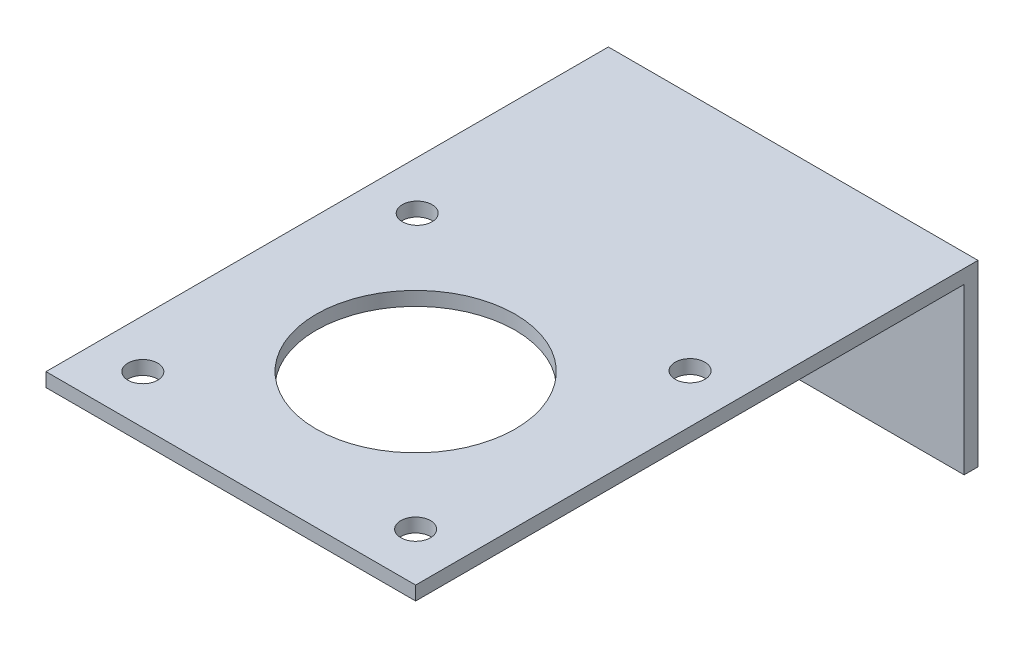
ISO-10303-21;
HEADER;
FILE_DESCRIPTION(('STEP AP214'),'2;1');
FILE_NAME('part.step','',(''),(''),'','','');
FILE_SCHEMA(('AUTOMOTIVE_DESIGN { 1 0 10303 214 1 1 1 1 }'));
ENDSEC;
DATA;
#1=APPLICATION_CONTEXT('core data for automotive mechanical design processes');
#2=APPLICATION_PROTOCOL_DEFINITION('international standard','automotive_design',2000,#1);
#3=PRODUCT_CONTEXT('',#1,'mechanical');
#4=PRODUCT('Part','Part','',(#3));
#5=PRODUCT_RELATED_PRODUCT_CATEGORY('part','',(#4));
#6=PRODUCT_DEFINITION_FORMATION('','',#4);
#7=PRODUCT_DEFINITION_CONTEXT('part definition',#1,'design');
#8=PRODUCT_DEFINITION('design','',#6,#7);
#9=PRODUCT_DEFINITION_SHAPE('','',#8);
#10=(LENGTH_UNIT() NAMED_UNIT(*) SI_UNIT(.MILLI.,.METRE.));
#11=(NAMED_UNIT(*) PLANE_ANGLE_UNIT() SI_UNIT($,.RADIAN.));
#12=(NAMED_UNIT(*) SI_UNIT($,.STERADIAN.) SOLID_ANGLE_UNIT());
#13=UNCERTAINTY_MEASURE_WITH_UNIT(LENGTH_MEASURE(1.E-05),#10,'distance_accuracy_value','');
#14=(GEOMETRIC_REPRESENTATION_CONTEXT(3) GLOBAL_UNCERTAINTY_ASSIGNED_CONTEXT((#13)) GLOBAL_UNIT_ASSIGNED_CONTEXT((#10,
#11,#12)) REPRESENTATION_CONTEXT('',''));
#15=CARTESIAN_POINT('',(0.,0.,0.));
#16=DIRECTION('',(0.,0.,1.));
#17=DIRECTION('',(1.,0.,0.));
#18=AXIS2_PLACEMENT_3D('',#15,#16,#17);
#19=CARTESIAN_POINT('',(0.,0.,1.5748));
#20=DIRECTION('',(0.,0.,1.));
#21=DIRECTION('',(1.,0.,0.));
#22=AXIS2_PLACEMENT_3D('',#19,#20,#21);
#23=PLANE('',#22);
#24=CARTESIAN_POINT('',(-9.035,0.,1.5748));
#25=DIRECTION('',(0.,0.,-1.));
#26=DIRECTION('',(-1.,0.,0.));
#27=AXIS2_PLACEMENT_3D('',#24,#25,#26);
#28=CIRCLE('',#27,2.05);
#29=CARTESIAN_POINT('',(-11.085,0.,1.5748));
#30=VERTEX_POINT('',#29);
#31=EDGE_CURVE('E148',#30,#30,#28,.T.);
#32=ORIENTED_EDGE('',*,*,#31,.T.);
#33=EDGE_LOOP('',(#32));
#34=FACE_BOUND('',#33,.T.);
#35=DIRECTION('',(1.,0.,0.));
#36=VECTOR('',#35,1.);
#37=CARTESIAN_POINT('',(-21.,8.5852,1.5748));
#38=LINE('',#37,#36);
#39=CARTESIAN_POINT('',(-21.,8.5852,1.5748));
#40=VERTEX_POINT('',#39);
#41=CARTESIAN_POINT('',(21.,8.5852,1.5748));
#42=VERTEX_POINT('',#41);
#43=EDGE_CURVE('E63',#40,#42,#38,.T.);
#44=ORIENTED_EDGE('',*,*,#43,.F.);
#45=DIRECTION('',(0.,-1.,0.));
#46=VECTOR('',#45,1.);
#47=CARTESIAN_POINT('',(-21.,-10.16,1.5748));
#48=LINE('',#47,#46);
#49=CARTESIAN_POINT('',(-21.,-10.16,1.5748));
#50=VERTEX_POINT('',#49);
#51=EDGE_CURVE('E102',#40,#50,#48,.T.);
#52=ORIENTED_EDGE('',*,*,#51,.T.);
#53=DIRECTION('',(1.,0.,0.));
#54=VECTOR('',#53,1.);
#55=CARTESIAN_POINT('',(-21.,-10.16,1.5748));
#56=LINE('',#55,#54);
#57=CARTESIAN_POINT('',(21.,-10.16,1.5748));
#58=VERTEX_POINT('',#57);
#59=EDGE_CURVE('E69',#50,#58,#56,.T.);
#60=ORIENTED_EDGE('',*,*,#59,.T.);
#61=DIRECTION('',(0.,1.,0.));
#62=VECTOR('',#61,1.);
#63=CARTESIAN_POINT('',(21.,-10.16,1.5748));
#64=LINE('',#63,#62);
#65=EDGE_CURVE('E114',#58,#42,#64,.T.);
#66=ORIENTED_EDGE('',*,*,#65,.T.);
#67=EDGE_LOOP('',(#44,#52,#60,#66));
#68=FACE_BOUND('',#67,.T.);
#69=CARTESIAN_POINT('',(9.035,0.,1.5748));
#70=DIRECTION('',(0.,0.,1.));
#71=DIRECTION('',(1.,0.,0.));
#72=AXIS2_PLACEMENT_3D('',#69,#70,#71);
#73=CIRCLE('',#72,2.05);
#74=CARTESIAN_POINT('',(11.085,0.,1.5748));
#75=VERTEX_POINT('',#74);
#76=EDGE_CURVE('E140',#75,#75,#73,.T.);
#77=ORIENTED_EDGE('',*,*,#76,.F.);
#78=EDGE_LOOP('',(#77));
#79=FACE_BOUND('',#78,.T.);
#80=ADVANCED_FACE('F45',(#34,#68,#79),#23,.T.);
#81=CARTESIAN_POINT('',(0.,0.,0.));
#82=DIRECTION('',(0.,0.,1.));
#83=DIRECTION('',(1.,0.,0.));
#84=AXIS2_PLACEMENT_3D('',#81,#82,#83);
#85=PLANE('',#84);
#86=DIRECTION('',(-1.,0.,0.));
#87=VECTOR('',#86,1.);
#88=CARTESIAN_POINT('',(-21.,10.16,0.));
#89=LINE('',#88,#87);
#90=CARTESIAN_POINT('',(21.,10.16,0.));
#91=VERTEX_POINT('',#90);
#92=CARTESIAN_POINT('',(-21.,10.16,0.));
#93=VERTEX_POINT('',#92);
#94=EDGE_CURVE('E110',#91,#93,#89,.T.);
#95=ORIENTED_EDGE('',*,*,#94,.F.);
#96=DIRECTION('',(0.,1.,0.));
#97=VECTOR('',#96,1.);
#98=CARTESIAN_POINT('',(21.,-10.16,0.));
#99=LINE('',#98,#97);
#100=CARTESIAN_POINT('',(21.,-10.16,0.));
#101=VERTEX_POINT('',#100);
#102=EDGE_CURVE('E89',#101,#91,#99,.T.);
#103=ORIENTED_EDGE('',*,*,#102,.F.);
#104=DIRECTION('',(1.,0.,0.));
#105=VECTOR('',#104,1.);
#106=CARTESIAN_POINT('',(-21.,-10.16,0.));
#107=LINE('',#106,#105);
#108=CARTESIAN_POINT('',(-21.,-10.16,0.));
#109=VERTEX_POINT('',#108);
#110=EDGE_CURVE('E103',#109,#101,#107,.T.);
#111=ORIENTED_EDGE('',*,*,#110,.F.);
#112=DIRECTION('',(0.,-1.,0.));
#113=VECTOR('',#112,1.);
#114=CARTESIAN_POINT('',(-21.,-10.16,0.));
#115=LINE('',#114,#113);
#116=EDGE_CURVE('E118',#93,#109,#115,.T.);
#117=ORIENTED_EDGE('',*,*,#116,.F.);
#118=EDGE_LOOP('',(#95,#103,#111,#117));
#119=FACE_BOUND('',#118,.T.);
#120=CARTESIAN_POINT('',(-9.035,0.,0.));
#121=DIRECTION('',(0.,0.,1.));
#122=DIRECTION('',(1.,0.,0.));
#123=AXIS2_PLACEMENT_3D('',#120,#121,#122);
#124=CIRCLE('',#123,2.05);
#125=CARTESIAN_POINT('',(-6.985,0.,0.));
#126=VERTEX_POINT('',#125);
#127=EDGE_CURVE('E137',#126,#126,#124,.F.);
#128=ORIENTED_EDGE('',*,*,#127,.F.);
#129=EDGE_LOOP('',(#128));
#130=FACE_BOUND('',#129,.T.);
#131=CARTESIAN_POINT('',(9.035,0.,0.));
#132=DIRECTION('',(0.,0.,1.));
#133=DIRECTION('',(1.,0.,0.));
#134=AXIS2_PLACEMENT_3D('',#131,#132,#133);
#135=CIRCLE('',#134,2.05);
#136=CARTESIAN_POINT('',(11.085,0.,0.));
#137=VERTEX_POINT('',#136);
#138=EDGE_CURVE('E49',#137,#137,#135,.T.);
#139=ORIENTED_EDGE('',*,*,#138,.T.);
#140=EDGE_LOOP('',(#139));
#141=FACE_BOUND('',#140,.T.);
#142=ADVANCED_FACE('F116',(#119,#130,#141),#85,.F.);
#143=CARTESIAN_POINT('',(-21.,10.16,1.5748));
#144=DIRECTION('',(0.,-1.,0.));
#145=DIRECTION('',(1.,0.,0.));
#146=AXIS2_PLACEMENT_3D('',#143,#144,#145);
#147=PLANE('',#146);
#148=CARTESIAN_POINT('',(15.5009,10.16,27.2175));
#149=DIRECTION('',(0.,-1.,0.));
#150=DIRECTION('',(1.,0.,0.));
#151=AXIS2_PLACEMENT_3D('',#148,#149,#150);
#152=CIRCLE('',#151,1.6891);
#153=CARTESIAN_POINT('',(17.19,10.16,27.2175));
#154=VERTEX_POINT('',#153);
#155=EDGE_CURVE('E183',#154,#154,#152,.T.);
#156=ORIENTED_EDGE('',*,*,#155,.T.);
#157=EDGE_LOOP('',(#156));
#158=FACE_BOUND('',#157,.T.);
#159=CARTESIAN_POINT('',(0.,10.16,42.8918));
#160=DIRECTION('',(0.,-1.,0.));
#161=DIRECTION('',(1.,0.,0.));
#162=AXIS2_PLACEMENT_3D('',#159,#160,#161);
#163=CIRCLE('',#162,11.303);
#164=CARTESIAN_POINT('',(11.303,10.16,42.8918));
#165=VERTEX_POINT('',#164);
#166=EDGE_CURVE('E179',#165,#165,#163,.T.);
#167=ORIENTED_EDGE('',*,*,#166,.T.);
#168=EDGE_LOOP('',(#167));
#169=FACE_BOUND('',#168,.T.);
#170=CARTESIAN_POINT('',(15.5009,10.16,58.3957));
#171=DIRECTION('',(0.,-1.,0.));
#172=DIRECTION('',(1.,0.,0.));
#173=AXIS2_PLACEMENT_3D('',#170,#171,#172);
#174=CIRCLE('',#173,1.6891);
#175=CARTESIAN_POINT('',(17.19,10.16,58.3957));
#176=VERTEX_POINT('',#175);
#177=EDGE_CURVE('E175',#176,#176,#174,.T.);
#178=ORIENTED_EDGE('',*,*,#177,.T.);
#179=EDGE_LOOP('',(#178));
#180=FACE_BOUND('',#179,.T.);
#181=ORIENTED_EDGE('',*,*,#94,.T.);
#182=DIRECTION('',(0.,0.,-1.));
#183=VECTOR('',#182,1.);
#184=CARTESIAN_POINT('',(-21.,10.16,1.5748));
#185=LINE('',#184,#183);
#186=CARTESIAN_POINT('',(-21.,10.16,63.8948));
#187=VERTEX_POINT('',#186);
#188=EDGE_CURVE('E11',#187,#93,#185,.T.);
#189=ORIENTED_EDGE('',*,*,#188,.F.);
#190=DIRECTION('',(-1.,0.,0.));
#191=VECTOR('',#190,1.);
#192=CARTESIAN_POINT('',(-21.,10.16,63.8948));
#193=LINE('',#192,#191);
#194=CARTESIAN_POINT('',(21.,10.16,63.8948));
#195=VERTEX_POINT('',#194);
#196=EDGE_CURVE('E112',#195,#187,#193,.T.);
#197=ORIENTED_EDGE('',*,*,#196,.F.);
#198=DIRECTION('',(0.,0.,-1.));
#199=VECTOR('',#198,1.);
#200=CARTESIAN_POINT('',(21.,10.16,1.5748));
#201=LINE('',#200,#199);
#202=EDGE_CURVE('E94',#195,#91,#201,.T.);
#203=ORIENTED_EDGE('',*,*,#202,.T.);
#204=EDGE_LOOP('',(#181,#189,#197,#203));
#205=FACE_BOUND('',#204,.T.);
#206=CARTESIAN_POINT('',(-15.5009,10.16,27.2175));
#207=DIRECTION('',(0.,-1.,0.));
#208=DIRECTION('',(1.,0.,0.));
#209=AXIS2_PLACEMENT_3D('',#206,#207,#208);
#210=CIRCLE('',#209,1.6891);
#211=CARTESIAN_POINT('',(-13.8118,10.16,27.2175));
#212=VERTEX_POINT('',#211);
#213=EDGE_CURVE('E187',#212,#212,#210,.F.);
#214=ORIENTED_EDGE('',*,*,#213,.F.);
#215=EDGE_LOOP('',(#214));
#216=FACE_BOUND('',#215,.T.);
#217=CARTESIAN_POINT('',(-15.5009,10.16,58.3957));
#218=DIRECTION('',(0.,-1.,0.));
#219=DIRECTION('',(1.,0.,0.));
#220=AXIS2_PLACEMENT_3D('',#217,#218,#219);
#221=CIRCLE('',#220,1.6891);
#222=CARTESIAN_POINT('',(-13.8118,10.16,58.3957));
#223=VERTEX_POINT('',#222);
#224=EDGE_CURVE('E191',#223,#223,#221,.F.);
#225=ORIENTED_EDGE('',*,*,#224,.F.);
#226=EDGE_LOOP('',(#225));
#227=FACE_BOUND('',#226,.T.);
#228=ADVANCED_FACE('F47',(#158,#169,#180,#205,#216,#227),#147,.F.);
#229=CARTESIAN_POINT('',(-21.,8.5852,63.8948));
#230=DIRECTION('',(0.,1.,0.));
#231=DIRECTION('',(0.,0.,1.));
#232=AXIS2_PLACEMENT_3D('',#229,#230,#231);
#233=PLANE('',#232);
#234=CARTESIAN_POINT('',(15.5009,8.5852,27.2175));
#235=DIRECTION('',(0.,-1.,0.));
#236=DIRECTION('',(0.,0.,-1.));
#237=AXIS2_PLACEMENT_3D('',#234,#235,#236);
#238=CIRCLE('',#237,1.6891);
#239=CARTESIAN_POINT('',(15.5009,8.5852,25.5284));
#240=VERTEX_POINT('',#239);
#241=EDGE_CURVE('E161',#240,#240,#238,.T.);
#242=ORIENTED_EDGE('',*,*,#241,.F.);
#243=EDGE_LOOP('',(#242));
#244=FACE_BOUND('',#243,.T.);
#245=CARTESIAN_POINT('',(0.,8.5852,42.8918));
#246=DIRECTION('',(0.,-1.,0.));
#247=DIRECTION('',(0.,0.,-1.));
#248=AXIS2_PLACEMENT_3D('',#245,#246,#247);
#249=CIRCLE('',#248,11.303);
#250=CARTESIAN_POINT('',(0.,8.5852,31.5888));
#251=VERTEX_POINT('',#250);
#252=EDGE_CURVE('E156',#251,#251,#249,.T.);
#253=ORIENTED_EDGE('',*,*,#252,.F.);
#254=EDGE_LOOP('',(#253));
#255=FACE_BOUND('',#254,.T.);
#256=CARTESIAN_POINT('',(15.5009,8.5852,58.3957));
#257=DIRECTION('',(0.,-1.,0.));
#258=DIRECTION('',(0.,0.,-1.));
#259=AXIS2_PLACEMENT_3D('',#256,#257,#258);
#260=CIRCLE('',#259,1.6891);
#261=CARTESIAN_POINT('',(15.5009,8.5852,56.7066));
#262=VERTEX_POINT('',#261);
#263=EDGE_CURVE('E160',#262,#262,#260,.T.);
#264=ORIENTED_EDGE('',*,*,#263,.F.);
#265=EDGE_LOOP('',(#264));
#266=FACE_BOUND('',#265,.T.);
#267=ORIENTED_EDGE('',*,*,#43,.T.);
#268=DIRECTION('',(0.,0.,-1.));
#269=VECTOR('',#268,1.);
#270=CARTESIAN_POINT('',(21.,8.5852,63.8948));
#271=LINE('',#270,#269);
#272=CARTESIAN_POINT('',(21.,8.5852,63.8948));
#273=VERTEX_POINT('',#272);
#274=EDGE_CURVE('E126',#273,#42,#271,.T.);
#275=ORIENTED_EDGE('',*,*,#274,.F.);
#276=DIRECTION('',(1.,0.,0.));
#277=VECTOR('',#276,1.);
#278=CARTESIAN_POINT('',(-21.,8.5852,63.8948));
#279=LINE('',#278,#277);
#280=CARTESIAN_POINT('',(-21.,8.5852,63.8948));
#281=VERTEX_POINT('',#280);
#282=EDGE_CURVE('E199',#281,#273,#279,.T.);
#283=ORIENTED_EDGE('',*,*,#282,.F.);
#284=DIRECTION('',(0.,0.,-1.));
#285=VECTOR('',#284,1.);
#286=CARTESIAN_POINT('',(-21.,8.5852,63.8948));
#287=LINE('',#286,#285);
#288=EDGE_CURVE('E120',#281,#40,#287,.T.);
#289=ORIENTED_EDGE('',*,*,#288,.T.);
#290=EDGE_LOOP('',(#267,#275,#283,#289));
#291=FACE_BOUND('',#290,.T.);
#292=CARTESIAN_POINT('',(-15.5009,8.5852,27.2175));
#293=DIRECTION('',(0.,1.,0.));
#294=DIRECTION('',(0.,0.,1.));
#295=AXIS2_PLACEMENT_3D('',#292,#293,#294);
#296=CIRCLE('',#295,1.6891);
#297=CARTESIAN_POINT('',(-15.5009,8.5852,28.9066));
#298=VERTEX_POINT('',#297);
#299=EDGE_CURVE('E165',#298,#298,#296,.T.);
#300=ORIENTED_EDGE('',*,*,#299,.T.);
#301=EDGE_LOOP('',(#300));
#302=FACE_BOUND('',#301,.T.);
#303=CARTESIAN_POINT('',(-15.5009,8.5852,58.3957));
#304=DIRECTION('',(0.,1.,0.));
#305=DIRECTION('',(0.,0.,1.));
#306=AXIS2_PLACEMENT_3D('',#303,#304,#305);
#307=CIRCLE('',#306,1.6891);
#308=CARTESIAN_POINT('',(-15.5009,8.5852,60.0848));
#309=VERTEX_POINT('',#308);
#310=EDGE_CURVE('E146',#309,#309,#307,.T.);
#311=ORIENTED_EDGE('',*,*,#310,.T.);
#312=EDGE_LOOP('',(#311));
#313=FACE_BOUND('',#312,.T.);
#314=ADVANCED_FACE('F221',(#244,#255,#266,#291,#302,#313),#233,.F.);
#315=CARTESIAN_POINT('',(-21.,-10.16,1.5748));
#316=DIRECTION('',(1.,0.,0.));
#317=DIRECTION('',(0.,0.,-1.));
#318=AXIS2_PLACEMENT_3D('',#315,#316,#317);
#319=PLANE('',#318);
#320=ORIENTED_EDGE('',*,*,#116,.T.);
#321=DIRECTION('',(0.,0.,-1.));
#322=VECTOR('',#321,1.);
#323=CARTESIAN_POINT('',(-21.,-10.16,1.5748));
#324=LINE('',#323,#322);
#325=EDGE_CURVE('E55',#50,#109,#324,.T.);
#326=ORIENTED_EDGE('',*,*,#325,.F.);
#327=ORIENTED_EDGE('',*,*,#51,.F.);
#328=ORIENTED_EDGE('',*,*,#288,.F.);
#329=DIRECTION('',(0.,-1.,0.));
#330=VECTOR('',#329,1.);
#331=CARTESIAN_POINT('',(-21.,10.16,63.8948));
#332=LINE('',#331,#330);
#333=EDGE_CURVE('E195',#187,#281,#332,.T.);
#334=ORIENTED_EDGE('',*,*,#333,.F.);
#335=ORIENTED_EDGE('',*,*,#188,.T.);
#336=EDGE_LOOP('',(#320,#326,#327,#328,#334,#335));
#337=FACE_BOUND('',#336,.T.);
#338=ADVANCED_FACE('F234',(#337),#319,.F.);
#339=CARTESIAN_POINT('',(-21.,-10.16,1.5748));
#340=DIRECTION('',(0.,1.,0.));
#341=DIRECTION('',(-1.,0.,0.));
#342=AXIS2_PLACEMENT_3D('',#339,#340,#341);
#343=PLANE('',#342);
#344=ORIENTED_EDGE('',*,*,#110,.T.);
#345=DIRECTION('',(0.,0.,-1.));
#346=VECTOR('',#345,1.);
#347=CARTESIAN_POINT('',(21.,-10.16,1.5748));
#348=LINE('',#347,#346);
#349=EDGE_CURVE('E97',#58,#101,#348,.T.);
#350=ORIENTED_EDGE('',*,*,#349,.F.);
#351=ORIENTED_EDGE('',*,*,#59,.F.);
#352=ORIENTED_EDGE('',*,*,#325,.T.);
#353=EDGE_LOOP('',(#344,#350,#351,#352));
#354=FACE_BOUND('',#353,.T.);
#355=ADVANCED_FACE('F237',(#354),#343,.F.);
#356=CARTESIAN_POINT('',(21.,-10.16,1.5748));
#357=DIRECTION('',(-1.,0.,0.));
#358=DIRECTION('',(0.,0.,1.));
#359=AXIS2_PLACEMENT_3D('',#356,#357,#358);
#360=PLANE('',#359);
#361=ORIENTED_EDGE('',*,*,#102,.T.);
#362=ORIENTED_EDGE('',*,*,#202,.F.);
#363=DIRECTION('',(0.,1.,0.));
#364=VECTOR('',#363,1.);
#365=CARTESIAN_POINT('',(21.,10.16,63.8948));
#366=LINE('',#365,#364);
#367=EDGE_CURVE('E203',#273,#195,#366,.T.);
#368=ORIENTED_EDGE('',*,*,#367,.F.);
#369=ORIENTED_EDGE('',*,*,#274,.T.);
#370=ORIENTED_EDGE('',*,*,#65,.F.);
#371=ORIENTED_EDGE('',*,*,#349,.T.);
#372=EDGE_LOOP('',(#361,#362,#368,#369,#370,#371));
#373=FACE_BOUND('',#372,.T.);
#374=ADVANCED_FACE('F91',(#373),#360,.F.);
#375=CARTESIAN_POINT('',(0.,0.,63.8948));
#376=DIRECTION('',(0.,0.,1.));
#377=DIRECTION('',(1.,0.,0.));
#378=AXIS2_PLACEMENT_3D('',#375,#376,#377);
#379=PLANE('',#378);
#380=ORIENTED_EDGE('',*,*,#333,.T.);
#381=ORIENTED_EDGE('',*,*,#282,.T.);
#382=ORIENTED_EDGE('',*,*,#367,.T.);
#383=ORIENTED_EDGE('',*,*,#196,.T.);
#384=EDGE_LOOP('',(#380,#381,#382,#383));
#385=FACE_BOUND('',#384,.T.);
#386=ADVANCED_FACE('F228',(#385),#379,.T.);
#387=CARTESIAN_POINT('',(15.5009,70.9052,58.3957));
#388=DIRECTION('',(0.,-1.,0.));
#389=DIRECTION('',(0.,0.,-1.));
#390=AXIS2_PLACEMENT_3D('',#387,#388,#389);
#391=CYLINDRICAL_SURFACE('',#390,1.6891);
#392=ORIENTED_EDGE('',*,*,#263,.T.);
#393=EDGE_LOOP('',(#392));
#394=FACE_BOUND('',#393,.T.);
#395=ORIENTED_EDGE('',*,*,#177,.F.);
#396=EDGE_LOOP('',(#395));
#397=FACE_BOUND('',#396,.T.);
#398=ADVANCED_FACE('F259',(#394,#397),#391,.F.);
#399=CARTESIAN_POINT('',(0.,70.9052,42.8918));
#400=DIRECTION('',(0.,-1.,0.));
#401=DIRECTION('',(0.,0.,-1.));
#402=AXIS2_PLACEMENT_3D('',#399,#400,#401);
#403=CYLINDRICAL_SURFACE('',#402,11.303);
#404=ORIENTED_EDGE('',*,*,#252,.T.);
#405=EDGE_LOOP('',(#404));
#406=FACE_BOUND('',#405,.T.);
#407=ORIENTED_EDGE('',*,*,#166,.F.);
#408=EDGE_LOOP('',(#407));
#409=FACE_BOUND('',#408,.T.);
#410=ADVANCED_FACE('F262',(#406,#409),#403,.F.);
#411=CARTESIAN_POINT('',(15.5009,70.9052,27.2175));
#412=DIRECTION('',(0.,-1.,0.));
#413=DIRECTION('',(0.,0.,-1.));
#414=AXIS2_PLACEMENT_3D('',#411,#412,#413);
#415=CYLINDRICAL_SURFACE('',#414,1.6891);
#416=ORIENTED_EDGE('',*,*,#241,.T.);
#417=EDGE_LOOP('',(#416));
#418=FACE_BOUND('',#417,.T.);
#419=ORIENTED_EDGE('',*,*,#155,.F.);
#420=EDGE_LOOP('',(#419));
#421=FACE_BOUND('',#420,.T.);
#422=ADVANCED_FACE('F271',(#418,#421),#415,.F.);
#423=CARTESIAN_POINT('',(-15.5009,70.9052,27.2175));
#424=DIRECTION('',(0.,-1.,0.));
#425=DIRECTION('',(0.,0.,-1.));
#426=AXIS2_PLACEMENT_3D('',#423,#424,#425);
#427=CYLINDRICAL_SURFACE('',#426,1.6891);
#428=ORIENTED_EDGE('',*,*,#299,.F.);
#429=EDGE_LOOP('',(#428));
#430=FACE_BOUND('',#429,.T.);
#431=ORIENTED_EDGE('',*,*,#213,.T.);
#432=EDGE_LOOP('',(#431));
#433=FACE_BOUND('',#432,.T.);
#434=ADVANCED_FACE('F267',(#430,#433),#427,.F.);
#435=CARTESIAN_POINT('',(-15.5009,70.9052,58.3957));
#436=DIRECTION('',(0.,-1.,0.));
#437=DIRECTION('',(0.,0.,-1.));
#438=AXIS2_PLACEMENT_3D('',#435,#436,#437);
#439=CYLINDRICAL_SURFACE('',#438,1.6891);
#440=ORIENTED_EDGE('',*,*,#310,.F.);
#441=EDGE_LOOP('',(#440));
#442=FACE_BOUND('',#441,.T.);
#443=ORIENTED_EDGE('',*,*,#224,.T.);
#444=EDGE_LOOP('',(#443));
#445=FACE_BOUND('',#444,.T.);
#446=ADVANCED_FACE('F264',(#442,#445),#439,.F.);
#447=CARTESIAN_POINT('',(-9.035,0.,-60.7452));
#448=DIRECTION('',(0.,0.,1.));
#449=DIRECTION('',(1.,0.,0.));
#450=AXIS2_PLACEMENT_3D('',#447,#448,#449);
#451=CYLINDRICAL_SURFACE('',#450,2.05);
#452=ORIENTED_EDGE('',*,*,#31,.F.);
#453=EDGE_LOOP('',(#452));
#454=FACE_BOUND('',#453,.T.);
#455=ORIENTED_EDGE('',*,*,#127,.T.);
#456=EDGE_LOOP('',(#455));
#457=FACE_BOUND('',#456,.T.);
#458=ADVANCED_FACE('F266',(#454,#457),#451,.F.);
#459=CARTESIAN_POINT('',(9.035,0.,-60.7452));
#460=DIRECTION('',(0.,0.,1.));
#461=DIRECTION('',(1.,0.,0.));
#462=AXIS2_PLACEMENT_3D('',#459,#460,#461);
#463=CYLINDRICAL_SURFACE('',#462,2.05);
#464=ORIENTED_EDGE('',*,*,#76,.T.);
#465=EDGE_LOOP('',(#464));
#466=FACE_BOUND('',#465,.T.);
#467=ORIENTED_EDGE('',*,*,#138,.F.);
#468=EDGE_LOOP('',(#467));
#469=FACE_BOUND('',#468,.T.);
#470=ADVANCED_FACE('F281',(#466,#469),#463,.F.);
#471=CLOSED_SHELL('',(#80,#142,#228,#314,#338,#355,#374,#386,#398,#410,#422,#434,#446,#458,#470));
#472=MANIFOLD_SOLID_BREP('B2',#471);
#473=ADVANCED_BREP_SHAPE_REPRESENTATION('',(#18,#472),#14);
#474=SHAPE_DEFINITION_REPRESENTATION(#9,#473);
ENDSEC;
END-ISO-10303-21;
